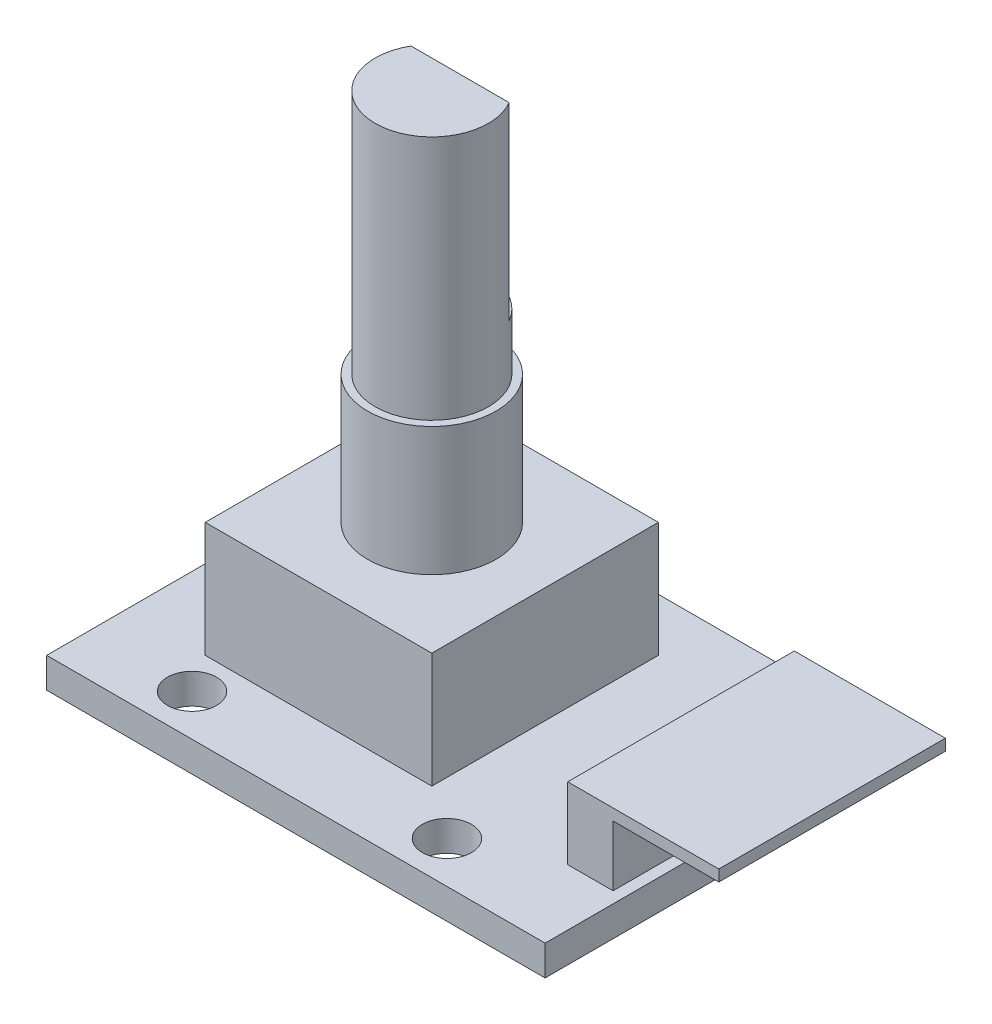
ISO-10303-21;
HEADER;
FILE_DESCRIPTION(('STEP AP214'),'2;1');
FILE_NAME('part.step','',(''),(''),'','','');
FILE_SCHEMA(('AUTOMOTIVE_DESIGN { 1 0 10303 214 1 1 1 1 }'));
ENDSEC;
DATA;
#1=APPLICATION_CONTEXT('core data for automotive mechanical design processes');
#2=APPLICATION_PROTOCOL_DEFINITION('international standard','automotive_design',2000,#1);
#3=PRODUCT_CONTEXT('',#1,'mechanical');
#4=PRODUCT('Part','Part','',(#3));
#5=PRODUCT_RELATED_PRODUCT_CATEGORY('part','',(#4));
#6=PRODUCT_DEFINITION_FORMATION('','',#4);
#7=PRODUCT_DEFINITION_CONTEXT('part definition',#1,'design');
#8=PRODUCT_DEFINITION('design','',#6,#7);
#9=PRODUCT_DEFINITION_SHAPE('','',#8);
#10=(LENGTH_UNIT() NAMED_UNIT(*) SI_UNIT(.MILLI.,.METRE.));
#11=(NAMED_UNIT(*) PLANE_ANGLE_UNIT() SI_UNIT($,.RADIAN.));
#12=(NAMED_UNIT(*) SI_UNIT($,.STERADIAN.) SOLID_ANGLE_UNIT());
#13=UNCERTAINTY_MEASURE_WITH_UNIT(LENGTH_MEASURE(1.E-05),#10,'distance_accuracy_value','');
#14=(GEOMETRIC_REPRESENTATION_CONTEXT(3) GLOBAL_UNCERTAINTY_ASSIGNED_CONTEXT((#13)) GLOBAL_UNIT_ASSIGNED_CONTEXT((#10,
#11,#12)) REPRESENTATION_CONTEXT('',''));
#15=CARTESIAN_POINT('',(0.,0.,0.));
#16=DIRECTION('',(0.,0.,1.));
#17=DIRECTION('',(1.,0.,0.));
#18=AXIS2_PLACEMENT_3D('',#15,#16,#17);
#19=CARTESIAN_POINT('',(0.,1.6,0.));
#20=DIRECTION('',(0.,-1.,0.));
#21=DIRECTION('',(0.,0.,-1.));
#22=AXIS2_PLACEMENT_3D('',#19,#20,#21);
#23=PLANE('',#22);
#24=DIRECTION('',(-1.,0.,0.));
#25=VECTOR('',#24,1.);
#26=CARTESIAN_POINT('',(0.,1.6,-19.));
#27=LINE('',#26,#25);
#28=CARTESIAN_POINT('',(26.4,1.6,-19.));
#29=VERTEX_POINT('',#28);
#30=CARTESIAN_POINT('',(0.,1.6,-19.));
#31=VERTEX_POINT('',#30);
#32=EDGE_CURVE('E261',#29,#31,#27,.T.);
#33=ORIENTED_EDGE('',*,*,#32,.T.);
#34=DIRECTION('',(0.,0.,1.));
#35=VECTOR('',#34,1.);
#36=CARTESIAN_POINT('',(0.,1.6,0.));
#37=LINE('',#36,#35);
#38=CARTESIAN_POINT('',(0.,1.6,0.));
#39=VERTEX_POINT('',#38);
#40=EDGE_CURVE('E253',#31,#39,#37,.T.);
#41=ORIENTED_EDGE('',*,*,#40,.T.);
#42=DIRECTION('',(1.,0.,0.));
#43=VECTOR('',#42,1.);
#44=CARTESIAN_POINT('',(0.,1.6,0.));
#45=LINE('',#44,#43);
#46=CARTESIAN_POINT('',(26.4,1.6,0.));
#47=VERTEX_POINT('',#46);
#48=EDGE_CURVE('E256',#39,#47,#45,.T.);
#49=ORIENTED_EDGE('',*,*,#48,.T.);
#50=DIRECTION('',(0.,0.,-1.));
#51=VECTOR('',#50,1.);
#52=CARTESIAN_POINT('',(26.4,1.6,0.));
#53=LINE('',#52,#51);
#54=EDGE_CURVE('E259',#47,#29,#53,.T.);
#55=ORIENTED_EDGE('',*,*,#54,.T.);
#56=EDGE_LOOP('',(#33,#41,#49,#55));
#57=FACE_BOUND('',#56,.T.);
#58=DIRECTION('',(0.,0.,1.));
#59=VECTOR('',#58,1.);
#60=CARTESIAN_POINT('',(4.2,1.6,-16.2));
#61=LINE('',#60,#59);
#62=CARTESIAN_POINT('',(4.2,1.6,-16.2));
#63=VERTEX_POINT('',#62);
#64=CARTESIAN_POINT('',(4.2,1.6,-4.2));
#65=VERTEX_POINT('',#64);
#66=EDGE_CURVE('E204',#63,#65,#61,.T.);
#67=ORIENTED_EDGE('',*,*,#66,.F.);
#68=DIRECTION('',(-1.,0.,0.));
#69=VECTOR('',#68,1.);
#70=CARTESIAN_POINT('',(4.2,1.6,-16.2));
#71=LINE('',#70,#69);
#72=CARTESIAN_POINT('',(16.2,1.6,-16.2));
#73=VERTEX_POINT('',#72);
#74=EDGE_CURVE('E212',#73,#63,#71,.T.);
#75=ORIENTED_EDGE('',*,*,#74,.F.);
#76=DIRECTION('',(0.,0.,-1.));
#77=VECTOR('',#76,1.);
#78=CARTESIAN_POINT('',(16.2,1.6,-16.2));
#79=LINE('',#78,#77);
#80=CARTESIAN_POINT('',(16.2,1.6,-4.2));
#81=VERTEX_POINT('',#80);
#82=EDGE_CURVE('E224',#81,#73,#79,.T.);
#83=ORIENTED_EDGE('',*,*,#82,.F.);
#84=DIRECTION('',(1.,0.,0.));
#85=VECTOR('',#84,1.);
#86=CARTESIAN_POINT('',(4.2,1.6,-4.2));
#87=LINE('',#86,#85);
#88=EDGE_CURVE('E221',#65,#81,#87,.T.);
#89=ORIENTED_EDGE('',*,*,#88,.F.);
#90=EDGE_LOOP('',(#67,#75,#83,#89));
#91=FACE_BOUND('',#90,.T.);
#92=CARTESIAN_POINT('',(5.5,1.6,-2.2));
#93=DIRECTION('',(0.,1.,0.));
#94=DIRECTION('',(0.,0.,1.));
#95=AXIS2_PLACEMENT_3D('',#92,#93,#94);
#96=CIRCLE('',#95,1.3);
#97=CARTESIAN_POINT('',(5.5,1.6,-0.9));
#98=VERTEX_POINT('',#97);
#99=EDGE_CURVE('E245',#98,#98,#96,.T.);
#100=ORIENTED_EDGE('',*,*,#99,.F.);
#101=EDGE_LOOP('',(#100));
#102=FACE_BOUND('',#101,.T.);
#103=CARTESIAN_POINT('',(19.,1.6,-2.2));
#104=DIRECTION('',(0.,1.,0.));
#105=DIRECTION('',(0.,0.,1.));
#106=AXIS2_PLACEMENT_3D('',#103,#104,#105);
#107=CIRCLE('',#106,1.3);
#108=CARTESIAN_POINT('',(19.,1.6,-0.900000000000002));
#109=VERTEX_POINT('',#108);
#110=EDGE_CURVE('E248',#109,#109,#107,.T.);
#111=ORIENTED_EDGE('',*,*,#110,.F.);
#112=EDGE_LOOP('',(#111));
#113=FACE_BOUND('',#112,.T.);
#114=DIRECTION('',(-1.,0.,0.));
#115=VECTOR('',#114,1.);
#116=CARTESIAN_POINT('',(0.,1.6,-16.2));
#117=LINE('',#116,#115);
#118=CARTESIAN_POINT('',(25.8,1.6,-16.2));
#119=VERTEX_POINT('',#118);
#120=CARTESIAN_POINT('',(23.4,1.6,-16.2));
#121=VERTEX_POINT('',#120);
#122=EDGE_CURVE('E61',#119,#121,#117,.T.);
#123=ORIENTED_EDGE('',*,*,#122,.F.);
#124=DIRECTION('',(0.,0.,1.));
#125=VECTOR('',#124,1.);
#126=CARTESIAN_POINT('',(25.8,1.6,-19.));
#127=LINE('',#126,#125);
#128=CARTESIAN_POINT('',(25.8,1.6,-4.2));
#129=VERTEX_POINT('',#128);
#130=EDGE_CURVE('E308',#119,#129,#127,.T.);
#131=ORIENTED_EDGE('',*,*,#130,.T.);
#132=DIRECTION('',(-1.,0.,0.));
#133=VECTOR('',#132,1.);
#134=CARTESIAN_POINT('',(0.,1.6,-4.2));
#135=LINE('',#134,#133);
#136=CARTESIAN_POINT('',(23.4,1.6,-4.2));
#137=VERTEX_POINT('',#136);
#138=EDGE_CURVE('E313',#129,#137,#135,.T.);
#139=ORIENTED_EDGE('',*,*,#138,.T.);
#140=DIRECTION('',(0.,0.,1.));
#141=VECTOR('',#140,1.);
#142=CARTESIAN_POINT('',(23.4,1.6,0.));
#143=LINE('',#142,#141);
#144=EDGE_CURVE('E310',#121,#137,#143,.T.);
#145=ORIENTED_EDGE('',*,*,#144,.F.);
#146=EDGE_LOOP('',(#123,#131,#139,#145));
#147=FACE_BOUND('',#146,.T.);
#148=ADVANCED_FACE('F39',(#57,#91,#102,#113,#147),#23,.F.);
#149=CARTESIAN_POINT('',(10.2,17.5,-10.2));
#150=DIRECTION('',(0.,1.,0.));
#151=DIRECTION('',(0.,0.,1.));
#152=AXIS2_PLACEMENT_3D('',#149,#150,#151);
#153=PLANE('',#152);
#154=CARTESIAN_POINT('',(10.2,17.5,-10.2));
#155=DIRECTION('',(0.,1.,0.));
#156=DIRECTION('',(0.,0.,1.));
#157=AXIS2_PLACEMENT_3D('',#154,#155,#156);
#158=CIRCLE('',#157,3.);
#159=CARTESIAN_POINT('',(12.7980762113533,17.5,-11.7));
#160=VERTEX_POINT('',#159);
#161=CARTESIAN_POINT('',(7.60192378864668,17.5,-11.7));
#162=VERTEX_POINT('',#161);
#163=EDGE_CURVE('E195',#160,#162,#158,.T.);
#164=ORIENTED_EDGE('',*,*,#163,.T.);
#165=DIRECTION('',(1.,0.,0.));
#166=VECTOR('',#165,1.);
#167=CARTESIAN_POINT('',(0.,17.5,-11.7));
#168=LINE('',#167,#166);
#169=EDGE_CURVE('E183',#162,#160,#168,.T.);
#170=ORIENTED_EDGE('',*,*,#169,.T.);
#171=EDGE_LOOP('',(#164,#170));
#172=FACE_BOUND('',#171,.T.);
#173=ADVANCED_FACE('F301',(#172),#153,.T.);
#174=CARTESIAN_POINT('',(0.,1.6,0.));
#175=DIRECTION('',(1.,0.,0.));
#176=DIRECTION('',(0.,0.,-1.));
#177=AXIS2_PLACEMENT_3D('',#174,#175,#176);
#178=PLANE('',#177);
#179=DIRECTION('',(0.,0.,1.));
#180=VECTOR('',#179,1.);
#181=CARTESIAN_POINT('',(0.,0.,0.));
#182=LINE('',#181,#180);
#183=CARTESIAN_POINT('',(0.,0.,-19.));
#184=VERTEX_POINT('',#183);
#185=CARTESIAN_POINT('',(0.,0.,0.));
#186=VERTEX_POINT('',#185);
#187=EDGE_CURVE('E244',#184,#186,#182,.T.);
#188=ORIENTED_EDGE('',*,*,#187,.T.);
#189=DIRECTION('',(0.,-1.,0.));
#190=VECTOR('',#189,1.);
#191=CARTESIAN_POINT('',(0.,1.6,0.));
#192=LINE('',#191,#190);
#193=EDGE_CURVE('E207',#39,#186,#192,.T.);
#194=ORIENTED_EDGE('',*,*,#193,.F.);
#195=ORIENTED_EDGE('',*,*,#40,.F.);
#196=DIRECTION('',(0.,-1.,0.));
#197=VECTOR('',#196,1.);
#198=CARTESIAN_POINT('',(0.,1.6,-19.));
#199=LINE('',#198,#197);
#200=EDGE_CURVE('E263',#31,#184,#199,.T.);
#201=ORIENTED_EDGE('',*,*,#200,.T.);
#202=EDGE_LOOP('',(#188,#194,#195,#201));
#203=FACE_BOUND('',#202,.T.);
#204=ADVANCED_FACE('F41',(#203),#178,.F.);
#205=CARTESIAN_POINT('',(0.,1.6,0.));
#206=DIRECTION('',(0.,0.,-1.));
#207=DIRECTION('',(-1.,0.,0.));
#208=AXIS2_PLACEMENT_3D('',#205,#206,#207);
#209=PLANE('',#208);
#210=DIRECTION('',(1.,0.,0.));
#211=VECTOR('',#210,1.);
#212=CARTESIAN_POINT('',(0.,0.,0.));
#213=LINE('',#212,#211);
#214=CARTESIAN_POINT('',(26.4,0.,0.));
#215=VERTEX_POINT('',#214);
#216=EDGE_CURVE('E266',#186,#215,#213,.T.);
#217=ORIENTED_EDGE('',*,*,#216,.T.);
#218=DIRECTION('',(0.,-1.,0.));
#219=VECTOR('',#218,1.);
#220=CARTESIAN_POINT('',(26.4,1.6,0.));
#221=LINE('',#220,#219);
#222=EDGE_CURVE('E276',#47,#215,#221,.T.);
#223=ORIENTED_EDGE('',*,*,#222,.F.);
#224=ORIENTED_EDGE('',*,*,#48,.F.);
#225=ORIENTED_EDGE('',*,*,#193,.T.);
#226=EDGE_LOOP('',(#217,#223,#224,#225));
#227=FACE_BOUND('',#226,.T.);
#228=ADVANCED_FACE('F281',(#227),#209,.F.);
#229=CARTESIAN_POINT('',(26.4,1.6,0.));
#230=DIRECTION('',(-1.,0.,0.));
#231=DIRECTION('',(0.,0.,1.));
#232=AXIS2_PLACEMENT_3D('',#229,#230,#231);
#233=PLANE('',#232);
#234=DIRECTION('',(0.,0.,-1.));
#235=VECTOR('',#234,1.);
#236=CARTESIAN_POINT('',(26.4,0.,0.));
#237=LINE('',#236,#235);
#238=CARTESIAN_POINT('',(26.4,0.,-19.));
#239=VERTEX_POINT('',#238);
#240=EDGE_CURVE('E268',#215,#239,#237,.T.);
#241=ORIENTED_EDGE('',*,*,#240,.T.);
#242=DIRECTION('',(0.,-1.,0.));
#243=VECTOR('',#242,1.);
#244=CARTESIAN_POINT('',(26.4,1.6,-19.));
#245=LINE('',#244,#243);
#246=EDGE_CURVE('E273',#29,#239,#245,.T.);
#247=ORIENTED_EDGE('',*,*,#246,.F.);
#248=ORIENTED_EDGE('',*,*,#54,.F.);
#249=ORIENTED_EDGE('',*,*,#222,.T.);
#250=EDGE_LOOP('',(#241,#247,#248,#249));
#251=FACE_BOUND('',#250,.T.);
#252=ADVANCED_FACE('F293',(#251),#233,.F.);
#253=CARTESIAN_POINT('',(0.,1.6,-19.));
#254=DIRECTION('',(0.,0.,1.));
#255=DIRECTION('',(1.,0.,0.));
#256=AXIS2_PLACEMENT_3D('',#253,#254,#255);
#257=PLANE('',#256);
#258=DIRECTION('',(-1.,0.,0.));
#259=VECTOR('',#258,1.);
#260=CARTESIAN_POINT('',(0.,0.,-19.));
#261=LINE('',#260,#259);
#262=EDGE_CURVE('E257',#239,#184,#261,.T.);
#263=ORIENTED_EDGE('',*,*,#262,.T.);
#264=ORIENTED_EDGE('',*,*,#200,.F.);
#265=ORIENTED_EDGE('',*,*,#32,.F.);
#266=ORIENTED_EDGE('',*,*,#246,.T.);
#267=EDGE_LOOP('',(#263,#264,#265,#266));
#268=FACE_BOUND('',#267,.T.);
#269=ADVANCED_FACE('F297',(#268),#257,.F.);
#270=CARTESIAN_POINT('',(0.,0.,0.));
#271=DIRECTION('',(0.,-1.,0.));
#272=DIRECTION('',(0.,0.,-1.));
#273=AXIS2_PLACEMENT_3D('',#270,#271,#272);
#274=PLANE('',#273);
#275=CARTESIAN_POINT('',(5.5,0.,-2.2));
#276=DIRECTION('',(0.,1.,0.));
#277=DIRECTION('',(0.,0.,1.));
#278=AXIS2_PLACEMENT_3D('',#275,#276,#277);
#279=CIRCLE('',#278,1.3);
#280=CARTESIAN_POINT('',(5.5,0.,-0.9));
#281=VERTEX_POINT('',#280);
#282=EDGE_CURVE('E241',#281,#281,#279,.T.);
#283=ORIENTED_EDGE('',*,*,#282,.T.);
#284=EDGE_LOOP('',(#283));
#285=FACE_BOUND('',#284,.T.);
#286=CARTESIAN_POINT('',(19.,0.,-2.2));
#287=DIRECTION('',(0.,1.,0.));
#288=DIRECTION('',(0.,0.,1.));
#289=AXIS2_PLACEMENT_3D('',#286,#287,#288);
#290=CIRCLE('',#289,1.3);
#291=CARTESIAN_POINT('',(19.,0.,-0.900000000000002));
#292=VERTEX_POINT('',#291);
#293=EDGE_CURVE('E240',#292,#292,#290,.T.);
#294=ORIENTED_EDGE('',*,*,#293,.T.);
#295=EDGE_LOOP('',(#294));
#296=FACE_BOUND('',#295,.T.);
#297=ORIENTED_EDGE('',*,*,#187,.F.);
#298=ORIENTED_EDGE('',*,*,#262,.F.);
#299=ORIENTED_EDGE('',*,*,#240,.F.);
#300=ORIENTED_EDGE('',*,*,#216,.F.);
#301=EDGE_LOOP('',(#297,#298,#299,#300));
#302=FACE_BOUND('',#301,.T.);
#303=ADVANCED_FACE('F289',(#285,#296,#302),#274,.T.);
#304=CARTESIAN_POINT('',(19.,0.,-2.2));
#305=DIRECTION('',(0.,1.,0.));
#306=DIRECTION('',(0.,0.,1.));
#307=AXIS2_PLACEMENT_3D('',#304,#305,#306);
#308=CYLINDRICAL_SURFACE('',#307,1.3);
#309=ORIENTED_EDGE('',*,*,#293,.F.);
#310=EDGE_LOOP('',(#309));
#311=FACE_BOUND('',#310,.T.);
#312=ORIENTED_EDGE('',*,*,#110,.T.);
#313=EDGE_LOOP('',(#312));
#314=FACE_BOUND('',#313,.T.);
#315=ADVANCED_FACE('F401',(#311,#314),#308,.F.);
#316=CARTESIAN_POINT('',(5.5,0.,-2.2));
#317=DIRECTION('',(0.,1.,0.));
#318=DIRECTION('',(0.,0.,1.));
#319=AXIS2_PLACEMENT_3D('',#316,#317,#318);
#320=CYLINDRICAL_SURFACE('',#319,1.3);
#321=ORIENTED_EDGE('',*,*,#282,.F.);
#322=EDGE_LOOP('',(#321));
#323=FACE_BOUND('',#322,.T.);
#324=ORIENTED_EDGE('',*,*,#99,.T.);
#325=EDGE_LOOP('',(#324));
#326=FACE_BOUND('',#325,.T.);
#327=ADVANCED_FACE('F397',(#323,#326),#320,.F.);
#328=CARTESIAN_POINT('',(4.2,7.7,-16.2));
#329=DIRECTION('',(1.,0.,0.));
#330=DIRECTION('',(0.,0.,-1.));
#331=AXIS2_PLACEMENT_3D('',#328,#329,#330);
#332=PLANE('',#331);
#333=ORIENTED_EDGE('',*,*,#66,.T.);
#334=DIRECTION('',(0.,-1.,0.));
#335=VECTOR('',#334,1.);
#336=CARTESIAN_POINT('',(4.2,7.7,-4.2));
#337=LINE('',#336,#335);
#338=CARTESIAN_POINT('',(4.2,7.7,-4.2));
#339=VERTEX_POINT('',#338);
#340=EDGE_CURVE('E237',#339,#65,#337,.T.);
#341=ORIENTED_EDGE('',*,*,#340,.F.);
#342=DIRECTION('',(0.,0.,1.));
#343=VECTOR('',#342,1.);
#344=CARTESIAN_POINT('',(4.2,7.7,-16.2));
#345=LINE('',#344,#343);
#346=CARTESIAN_POINT('',(4.2,7.7,-16.2));
#347=VERTEX_POINT('',#346);
#348=EDGE_CURVE('E208',#347,#339,#345,.T.);
#349=ORIENTED_EDGE('',*,*,#348,.F.);
#350=DIRECTION('',(0.,-1.,0.));
#351=VECTOR('',#350,1.);
#352=CARTESIAN_POINT('',(4.2,7.7,-16.2));
#353=LINE('',#352,#351);
#354=EDGE_CURVE('E218',#347,#63,#353,.T.);
#355=ORIENTED_EDGE('',*,*,#354,.T.);
#356=EDGE_LOOP('',(#333,#341,#349,#355));
#357=FACE_BOUND('',#356,.T.);
#358=ADVANCED_FACE('F393',(#357),#332,.F.);
#359=CARTESIAN_POINT('',(4.2,7.7,-4.2));
#360=DIRECTION('',(0.,0.,-1.));
#361=DIRECTION('',(-1.,0.,0.));
#362=AXIS2_PLACEMENT_3D('',#359,#360,#361);
#363=PLANE('',#362);
#364=ORIENTED_EDGE('',*,*,#88,.T.);
#365=DIRECTION('',(0.,-1.,0.));
#366=VECTOR('',#365,1.);
#367=CARTESIAN_POINT('',(16.2,7.7,-4.2));
#368=LINE('',#367,#366);
#369=CARTESIAN_POINT('',(16.2,7.7,-4.2));
#370=VERTEX_POINT('',#369);
#371=EDGE_CURVE('E234',#370,#81,#368,.T.);
#372=ORIENTED_EDGE('',*,*,#371,.F.);
#373=DIRECTION('',(1.,0.,0.));
#374=VECTOR('',#373,1.);
#375=CARTESIAN_POINT('',(4.2,7.7,-4.2));
#376=LINE('',#375,#374);
#377=EDGE_CURVE('E211',#339,#370,#376,.T.);
#378=ORIENTED_EDGE('',*,*,#377,.F.);
#379=ORIENTED_EDGE('',*,*,#340,.T.);
#380=EDGE_LOOP('',(#364,#372,#378,#379));
#381=FACE_BOUND('',#380,.T.);
#382=ADVANCED_FACE('F389',(#381),#363,.F.);
#383=CARTESIAN_POINT('',(16.2,7.7,-16.2));
#384=DIRECTION('',(-1.,0.,0.));
#385=DIRECTION('',(0.,0.,1.));
#386=AXIS2_PLACEMENT_3D('',#383,#384,#385);
#387=PLANE('',#386);
#388=ORIENTED_EDGE('',*,*,#82,.T.);
#389=DIRECTION('',(0.,-1.,0.));
#390=VECTOR('',#389,1.);
#391=CARTESIAN_POINT('',(16.2,7.7,-16.2));
#392=LINE('',#391,#390);
#393=CARTESIAN_POINT('',(16.2,7.7,-16.2));
#394=VERTEX_POINT('',#393);
#395=EDGE_CURVE('E231',#394,#73,#392,.T.);
#396=ORIENTED_EDGE('',*,*,#395,.F.);
#397=DIRECTION('',(0.,0.,-1.));
#398=VECTOR('',#397,1.);
#399=CARTESIAN_POINT('',(16.2,7.7,-16.2));
#400=LINE('',#399,#398);
#401=EDGE_CURVE('E214',#370,#394,#400,.T.);
#402=ORIENTED_EDGE('',*,*,#401,.F.);
#403=ORIENTED_EDGE('',*,*,#371,.T.);
#404=EDGE_LOOP('',(#388,#396,#402,#403));
#405=FACE_BOUND('',#404,.T.);
#406=ADVANCED_FACE('F385',(#405),#387,.F.);
#407=CARTESIAN_POINT('',(4.2,7.7,-16.2));
#408=DIRECTION('',(0.,0.,1.));
#409=DIRECTION('',(1.,0.,0.));
#410=AXIS2_PLACEMENT_3D('',#407,#408,#409);
#411=PLANE('',#410);
#412=ORIENTED_EDGE('',*,*,#74,.T.);
#413=ORIENTED_EDGE('',*,*,#354,.F.);
#414=DIRECTION('',(-1.,0.,0.));
#415=VECTOR('',#414,1.);
#416=CARTESIAN_POINT('',(4.2,7.7,-16.2));
#417=LINE('',#416,#415);
#418=EDGE_CURVE('E216',#394,#347,#417,.T.);
#419=ORIENTED_EDGE('',*,*,#418,.F.);
#420=ORIENTED_EDGE('',*,*,#395,.T.);
#421=EDGE_LOOP('',(#412,#413,#419,#420));
#422=FACE_BOUND('',#421,.T.);
#423=ADVANCED_FACE('F381',(#422),#411,.F.);
#424=CARTESIAN_POINT('',(0.,7.7,0.));
#425=DIRECTION('',(0.,1.,0.));
#426=DIRECTION('',(0.,0.,1.));
#427=AXIS2_PLACEMENT_3D('',#424,#425,#426);
#428=PLANE('',#427);
#429=CARTESIAN_POINT('',(10.2,7.7,-10.2));
#430=DIRECTION('',(0.,1.,0.));
#431=DIRECTION('',(0.,0.,1.));
#432=AXIS2_PLACEMENT_3D('',#429,#430,#431);
#433=CIRCLE('',#432,3.4);
#434=CARTESIAN_POINT('',(10.2,7.7,-6.8));
#435=VERTEX_POINT('',#434);
#436=EDGE_CURVE('E201',#435,#435,#433,.T.);
#437=ORIENTED_EDGE('',*,*,#436,.F.);
#438=EDGE_LOOP('',(#437));
#439=FACE_BOUND('',#438,.T.);
#440=ORIENTED_EDGE('',*,*,#348,.T.);
#441=ORIENTED_EDGE('',*,*,#377,.T.);
#442=ORIENTED_EDGE('',*,*,#401,.T.);
#443=ORIENTED_EDGE('',*,*,#418,.T.);
#444=EDGE_LOOP('',(#440,#441,#442,#443));
#445=FACE_BOUND('',#444,.T.);
#446=ADVANCED_FACE('F377',(#439,#445),#428,.T.);
#447=CARTESIAN_POINT('',(10.2,14.5,-10.2));
#448=DIRECTION('',(0.,-1.,0.));
#449=DIRECTION('',(0.,0.,-1.));
#450=AXIS2_PLACEMENT_3D('',#447,#448,#449);
#451=CYLINDRICAL_SURFACE('',#450,3.4);
#452=CARTESIAN_POINT('',(10.2,14.5,-10.2));
#453=DIRECTION('',(0.,1.,0.));
#454=DIRECTION('',(0.,0.,1.));
#455=AXIS2_PLACEMENT_3D('',#452,#453,#454);
#456=CIRCLE('',#455,3.4);
#457=CARTESIAN_POINT('',(10.2,14.5,-6.8));
#458=VERTEX_POINT('',#457);
#459=EDGE_CURVE('E198',#458,#458,#456,.T.);
#460=ORIENTED_EDGE('',*,*,#459,.F.);
#461=EDGE_LOOP('',(#460));
#462=FACE_BOUND('',#461,.T.);
#463=ORIENTED_EDGE('',*,*,#436,.T.);
#464=EDGE_LOOP('',(#463));
#465=FACE_BOUND('',#464,.T.);
#466=ADVANCED_FACE('F373',(#462,#465),#451,.T.);
#467=CARTESIAN_POINT('',(10.2,14.5,-10.2));
#468=DIRECTION('',(0.,1.,0.));
#469=DIRECTION('',(0.,0.,1.));
#470=AXIS2_PLACEMENT_3D('',#467,#468,#469);
#471=PLANE('',#470);
#472=CARTESIAN_POINT('',(10.2,14.5,-10.2));
#473=DIRECTION('',(0.,1.,0.));
#474=DIRECTION('',(0.,0.,1.));
#475=AXIS2_PLACEMENT_3D('',#472,#473,#474);
#476=CIRCLE('',#475,3.);
#477=CARTESIAN_POINT('',(10.2,14.5,-7.2));
#478=VERTEX_POINT('',#477);
#479=EDGE_CURVE('E47',#478,#478,#476,.T.);
#480=ORIENTED_EDGE('',*,*,#479,.F.);
#481=EDGE_LOOP('',(#480));
#482=FACE_BOUND('',#481,.T.);
#483=ORIENTED_EDGE('',*,*,#459,.T.);
#484=EDGE_LOOP('',(#483));
#485=FACE_BOUND('',#484,.T.);
#486=ADVANCED_FACE('F369',(#482,#485),#471,.T.);
#487=CARTESIAN_POINT('',(10.2,17.5,-10.2));
#488=DIRECTION('',(0.,-1.,0.));
#489=DIRECTION('',(0.,0.,-1.));
#490=AXIS2_PLACEMENT_3D('',#487,#488,#489);
#491=CYLINDRICAL_SURFACE('',#490,3.);
#492=ORIENTED_EDGE('',*,*,#163,.F.);
#493=DIRECTION('',(0.,-1.,0.));
#494=VECTOR('',#493,1.);
#495=CARTESIAN_POINT('',(12.7980762113533,27.5,-11.7));
#496=LINE('',#495,#494);
#497=CARTESIAN_POINT('',(12.7980762113533,27.5,-11.7));
#498=VERTEX_POINT('',#497);
#499=EDGE_CURVE('E193',#498,#160,#496,.T.);
#500=ORIENTED_EDGE('',*,*,#499,.F.);
#501=CARTESIAN_POINT('',(10.2,27.5,-10.2));
#502=DIRECTION('',(0.,1.,0.));
#503=DIRECTION('',(0.,0.,1.));
#504=AXIS2_PLACEMENT_3D('',#501,#502,#503);
#505=CIRCLE('',#504,3.);
#506=CARTESIAN_POINT('',(7.60192378864668,27.5,-11.7));
#507=VERTEX_POINT('',#506);
#508=EDGE_CURVE('E184',#507,#498,#505,.T.);
#509=ORIENTED_EDGE('',*,*,#508,.F.);
#510=DIRECTION('',(0.,-1.,0.));
#511=VECTOR('',#510,1.);
#512=CARTESIAN_POINT('',(7.60192378864668,27.5,-11.7));
#513=LINE('',#512,#511);
#514=EDGE_CURVE('E189',#507,#162,#513,.T.);
#515=ORIENTED_EDGE('',*,*,#514,.T.);
#516=EDGE_LOOP('',(#492,#500,#509,#515));
#517=FACE_BOUND('',#516,.T.);
#518=ORIENTED_EDGE('',*,*,#479,.T.);
#519=EDGE_LOOP('',(#518));
#520=FACE_BOUND('',#519,.T.);
#521=ADVANCED_FACE('F362',(#517,#520),#491,.T.);
#522=CARTESIAN_POINT('',(0.,27.5,-11.7));
#523=DIRECTION('',(0.,0.,-1.));
#524=DIRECTION('',(-1.,0.,0.));
#525=AXIS2_PLACEMENT_3D('',#522,#523,#524);
#526=PLANE('',#525);
#527=ORIENTED_EDGE('',*,*,#169,.F.);
#528=ORIENTED_EDGE('',*,*,#514,.F.);
#529=DIRECTION('',(1.,0.,0.));
#530=VECTOR('',#529,1.);
#531=CARTESIAN_POINT('',(0.,27.5,-11.7));
#532=LINE('',#531,#530);
#533=EDGE_CURVE('E186',#507,#498,#532,.T.);
#534=ORIENTED_EDGE('',*,*,#533,.T.);
#535=ORIENTED_EDGE('',*,*,#499,.T.);
#536=EDGE_LOOP('',(#527,#528,#534,#535));
#537=FACE_BOUND('',#536,.T.);
#538=ADVANCED_FACE('F358',(#537),#526,.T.);
#539=CARTESIAN_POINT('',(0.,27.5,0.));
#540=DIRECTION('',(0.,1.,0.));
#541=DIRECTION('',(0.,0.,1.));
#542=AXIS2_PLACEMENT_3D('',#539,#540,#541);
#543=PLANE('',#542);
#544=ORIENTED_EDGE('',*,*,#508,.T.);
#545=ORIENTED_EDGE('',*,*,#533,.F.);
#546=EDGE_LOOP('',(#544,#545));
#547=FACE_BOUND('',#546,.T.);
#548=ADVANCED_FACE('F355',(#547),#543,.T.);
#549=CARTESIAN_POINT('',(0.,5.4,-16.2));
#550=DIRECTION('',(0.,0.,1.));
#551=DIRECTION('',(1.,0.,0.));
#552=AXIS2_PLACEMENT_3D('',#549,#550,#551);
#553=PLANE('',#552);
#554=DIRECTION('',(-1.,0.,0.));
#555=VECTOR('',#554,1.);
#556=CARTESIAN_POINT('',(0.,4.79999999999999,-16.2));
#557=LINE('',#556,#555);
#558=CARTESIAN_POINT('',(31.4,4.8,-16.2));
#559=VERTEX_POINT('',#558);
#560=CARTESIAN_POINT('',(25.8,4.8,-16.2));
#561=VERTEX_POINT('',#560);
#562=EDGE_CURVE('E53',#559,#561,#557,.T.);
#563=ORIENTED_EDGE('',*,*,#562,.T.);
#564=DIRECTION('',(0.,-1.,0.));
#565=VECTOR('',#564,1.);
#566=CARTESIAN_POINT('',(25.8,5.4,-16.2));
#567=LINE('',#566,#565);
#568=EDGE_CURVE('E311',#561,#119,#567,.T.);
#569=ORIENTED_EDGE('',*,*,#568,.T.);
#570=ORIENTED_EDGE('',*,*,#122,.T.);
#571=DIRECTION('',(0.,-1.,0.));
#572=VECTOR('',#571,1.);
#573=CARTESIAN_POINT('',(23.4,5.4,-16.2));
#574=LINE('',#573,#572);
#575=CARTESIAN_POINT('',(23.4,5.4,-16.2));
#576=VERTEX_POINT('',#575);
#577=EDGE_CURVE('E176',#576,#121,#574,.T.);
#578=ORIENTED_EDGE('',*,*,#577,.F.);
#579=DIRECTION('',(-1.,0.,0.));
#580=VECTOR('',#579,1.);
#581=CARTESIAN_POINT('',(0.,5.4,-16.2));
#582=LINE('',#581,#580);
#583=CARTESIAN_POINT('',(31.4,5.4,-16.2));
#584=VERTEX_POINT('',#583);
#585=EDGE_CURVE('E318',#584,#576,#582,.T.);
#586=ORIENTED_EDGE('',*,*,#585,.F.);
#587=DIRECTION('',(0.,-1.,0.));
#588=VECTOR('',#587,1.);
#589=CARTESIAN_POINT('',(31.4,5.4,-16.2));
#590=LINE('',#589,#588);
#591=EDGE_CURVE('E173',#584,#559,#590,.T.);
#592=ORIENTED_EDGE('',*,*,#591,.T.);
#593=EDGE_LOOP('',(#563,#569,#570,#578,#586,#592));
#594=FACE_BOUND('',#593,.T.);
#595=ADVANCED_FACE('F331',(#594),#553,.F.);
#596=CARTESIAN_POINT('',(23.4,5.4,0.));
#597=DIRECTION('',(1.,0.,0.));
#598=DIRECTION('',(0.,0.,-1.));
#599=AXIS2_PLACEMENT_3D('',#596,#597,#598);
#600=PLANE('',#599);
#601=ORIENTED_EDGE('',*,*,#144,.T.);
#602=DIRECTION('',(0.,-1.,0.));
#603=VECTOR('',#602,1.);
#604=CARTESIAN_POINT('',(23.4,5.4,-4.2));
#605=LINE('',#604,#603);
#606=CARTESIAN_POINT('',(23.4,5.4,-4.2));
#607=VERTEX_POINT('',#606);
#608=EDGE_CURVE('E172',#607,#137,#605,.T.);
#609=ORIENTED_EDGE('',*,*,#608,.F.);
#610=DIRECTION('',(0.,0.,1.));
#611=VECTOR('',#610,1.);
#612=CARTESIAN_POINT('',(23.4,5.4,0.));
#613=LINE('',#612,#611);
#614=EDGE_CURVE('E320',#576,#607,#613,.T.);
#615=ORIENTED_EDGE('',*,*,#614,.F.);
#616=ORIENTED_EDGE('',*,*,#577,.T.);
#617=EDGE_LOOP('',(#601,#609,#615,#616));
#618=FACE_BOUND('',#617,.T.);
#619=ADVANCED_FACE('F330',(#618),#600,.F.);
#620=CARTESIAN_POINT('',(0.,5.4,-4.2));
#621=DIRECTION('',(0.,0.,1.));
#622=DIRECTION('',(1.,0.,0.));
#623=AXIS2_PLACEMENT_3D('',#620,#621,#622);
#624=PLANE('',#623);
#625=DIRECTION('',(0.,-1.,0.));
#626=VECTOR('',#625,1.);
#627=CARTESIAN_POINT('',(25.8,1.6,-4.2));
#628=LINE('',#627,#626);
#629=CARTESIAN_POINT('',(25.8,4.8,-4.2));
#630=VERTEX_POINT('',#629);
#631=EDGE_CURVE('E166',#630,#129,#628,.T.);
#632=ORIENTED_EDGE('',*,*,#631,.F.);
#633=DIRECTION('',(-1.,0.,0.));
#634=VECTOR('',#633,1.);
#635=CARTESIAN_POINT('',(31.4,4.8,-4.2));
#636=LINE('',#635,#634);
#637=CARTESIAN_POINT('',(31.4,4.8,-4.2));
#638=VERTEX_POINT('',#637);
#639=EDGE_CURVE('E154',#638,#630,#636,.T.);
#640=ORIENTED_EDGE('',*,*,#639,.F.);
#641=DIRECTION('',(0.,-1.,0.));
#642=VECTOR('',#641,1.);
#643=CARTESIAN_POINT('',(31.4,5.4,-4.2));
#644=LINE('',#643,#642);
#645=CARTESIAN_POINT('',(31.4,5.4,-4.2));
#646=VERTEX_POINT('',#645);
#647=EDGE_CURVE('E162',#646,#638,#644,.T.);
#648=ORIENTED_EDGE('',*,*,#647,.F.);
#649=DIRECTION('',(-1.,0.,0.));
#650=VECTOR('',#649,1.);
#651=CARTESIAN_POINT('',(0.,5.4,-4.2));
#652=LINE('',#651,#650);
#653=EDGE_CURVE('E324',#646,#607,#652,.T.);
#654=ORIENTED_EDGE('',*,*,#653,.T.);
#655=ORIENTED_EDGE('',*,*,#608,.T.);
#656=ORIENTED_EDGE('',*,*,#138,.F.);
#657=EDGE_LOOP('',(#632,#640,#648,#654,#655,#656));
#658=FACE_BOUND('',#657,.T.);
#659=ADVANCED_FACE('F160',(#658),#624,.T.);
#660=CARTESIAN_POINT('',(31.4,5.4,0.));
#661=DIRECTION('',(1.,0.,0.));
#662=DIRECTION('',(0.,0.,-1.));
#663=AXIS2_PLACEMENT_3D('',#660,#661,#662);
#664=PLANE('',#663);
#665=DIRECTION('',(0.,0.,1.));
#666=VECTOR('',#665,1.);
#667=CARTESIAN_POINT('',(31.4,4.8,0.));
#668=LINE('',#667,#666);
#669=EDGE_CURVE('E11',#559,#638,#668,.T.);
#670=ORIENTED_EDGE('',*,*,#669,.F.);
#671=ORIENTED_EDGE('',*,*,#591,.F.);
#672=DIRECTION('',(0.,0.,1.));
#673=VECTOR('',#672,1.);
#674=CARTESIAN_POINT('',(31.4,5.4,0.));
#675=LINE('',#674,#673);
#676=EDGE_CURVE('E171',#584,#646,#675,.T.);
#677=ORIENTED_EDGE('',*,*,#676,.T.);
#678=ORIENTED_EDGE('',*,*,#647,.T.);
#679=EDGE_LOOP('',(#670,#671,#677,#678));
#680=FACE_BOUND('',#679,.T.);
#681=ADVANCED_FACE('F169',(#680),#664,.T.);
#682=CARTESIAN_POINT('',(0.,5.4,0.));
#683=DIRECTION('',(0.,1.,0.));
#684=DIRECTION('',(0.,0.,1.));
#685=AXIS2_PLACEMENT_3D('',#682,#683,#684);
#686=PLANE('',#685);
#687=ORIENTED_EDGE('',*,*,#585,.T.);
#688=ORIENTED_EDGE('',*,*,#614,.T.);
#689=ORIENTED_EDGE('',*,*,#653,.F.);
#690=ORIENTED_EDGE('',*,*,#676,.F.);
#691=EDGE_LOOP('',(#687,#688,#689,#690));
#692=FACE_BOUND('',#691,.T.);
#693=ADVANCED_FACE('F328',(#692),#686,.T.);
#694=CARTESIAN_POINT('',(25.8,1.6,-19.));
#695=DIRECTION('',(-1.,0.,0.));
#696=DIRECTION('',(0.,0.,1.));
#697=AXIS2_PLACEMENT_3D('',#694,#695,#696);
#698=PLANE('',#697);
#699=DIRECTION('',(0.,0.,1.));
#700=VECTOR('',#699,1.);
#701=CARTESIAN_POINT('',(25.8,4.8,-19.));
#702=LINE('',#701,#700);
#703=EDGE_CURVE('E332',#561,#630,#702,.T.);
#704=ORIENTED_EDGE('',*,*,#703,.T.);
#705=ORIENTED_EDGE('',*,*,#631,.T.);
#706=ORIENTED_EDGE('',*,*,#130,.F.);
#707=ORIENTED_EDGE('',*,*,#568,.F.);
#708=EDGE_LOOP('',(#704,#705,#706,#707));
#709=FACE_BOUND('',#708,.T.);
#710=ADVANCED_FACE('F337',(#709),#698,.F.);
#711=CARTESIAN_POINT('',(31.4,4.8,-19.));
#712=DIRECTION('',(0.,1.,0.));
#713=DIRECTION('',(-1.,0.,0.));
#714=AXIS2_PLACEMENT_3D('',#711,#712,#713);
#715=PLANE('',#714);
#716=ORIENTED_EDGE('',*,*,#669,.T.);
#717=ORIENTED_EDGE('',*,*,#639,.T.);
#718=ORIENTED_EDGE('',*,*,#703,.F.);
#719=ORIENTED_EDGE('',*,*,#562,.F.);
#720=EDGE_LOOP('',(#716,#717,#718,#719));
#721=FACE_BOUND('',#720,.T.);
#722=ADVANCED_FACE('F153',(#721),#715,.F.);
#723=CLOSED_SHELL('',(#148,#173,#204,#228,#252,#269,#303,#315,#327,#358,#382,#406,#423,#446,
#466,#486,#521,#538,#548,#595,#619,#659,#681,#693,#710,#722));
#724=MANIFOLD_SOLID_BREP('B2',#723);
#725=ADVANCED_BREP_SHAPE_REPRESENTATION('',(#18,#724),#14);
#726=SHAPE_DEFINITION_REPRESENTATION(#9,#725);
ENDSEC;
END-ISO-10303-21;
